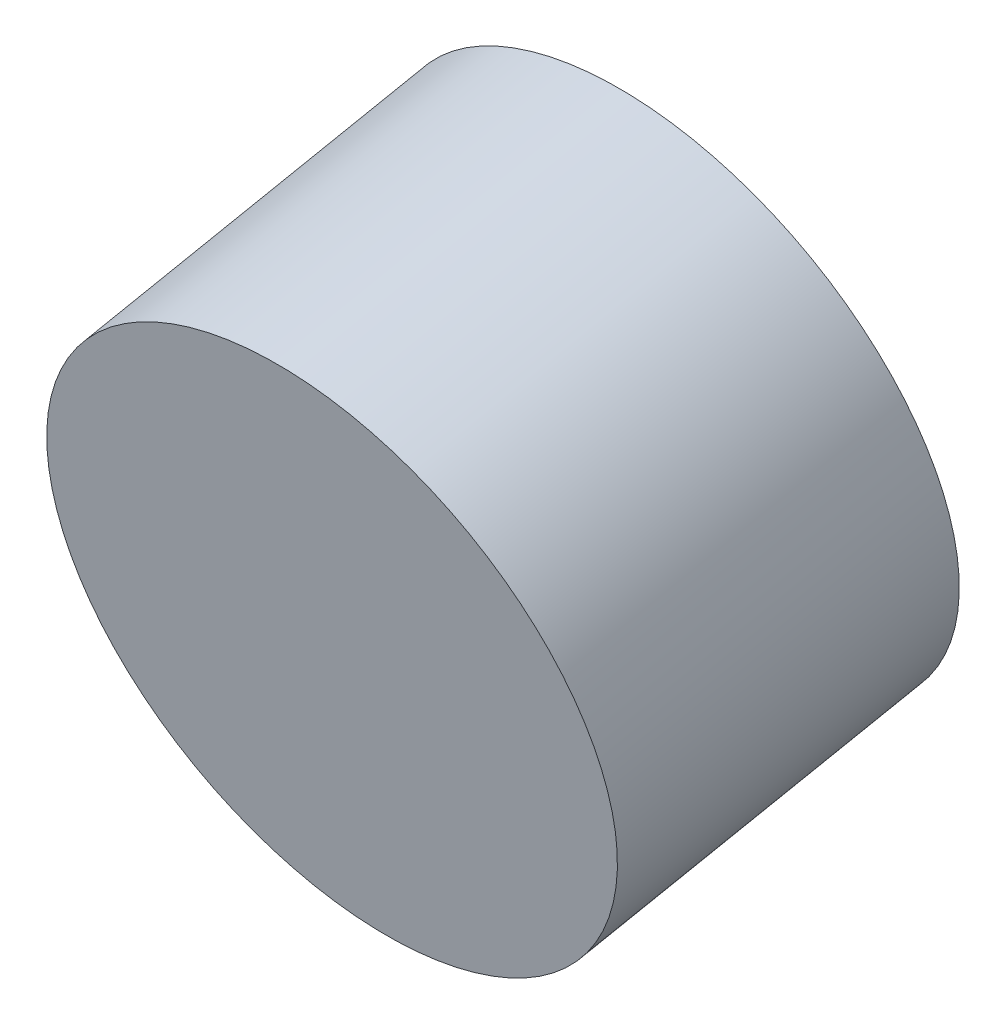
ISO-10303-21;
HEADER;
FILE_DESCRIPTION(('STEP AP214'),'2;1');
FILE_NAME('part.step','',(''),(''),'','','');
FILE_SCHEMA(('AUTOMOTIVE_DESIGN { 1 0 10303 214 1 1 1 1 }'));
ENDSEC;
DATA;
#1=APPLICATION_CONTEXT('core data for automotive mechanical design processes');
#2=APPLICATION_PROTOCOL_DEFINITION('international standard','automotive_design',2000,#1);
#3=PRODUCT_CONTEXT('',#1,'mechanical');
#4=PRODUCT('Part','Part','',(#3));
#5=PRODUCT_RELATED_PRODUCT_CATEGORY('part','',(#4));
#6=PRODUCT_DEFINITION_FORMATION('','',#4);
#7=PRODUCT_DEFINITION_CONTEXT('part definition',#1,'design');
#8=PRODUCT_DEFINITION('design','',#6,#7);
#9=PRODUCT_DEFINITION_SHAPE('','',#8);
#10=(LENGTH_UNIT() NAMED_UNIT(*) SI_UNIT(.MILLI.,.METRE.));
#11=(NAMED_UNIT(*) PLANE_ANGLE_UNIT() SI_UNIT($,.RADIAN.));
#12=(NAMED_UNIT(*) SI_UNIT($,.STERADIAN.) SOLID_ANGLE_UNIT());
#13=UNCERTAINTY_MEASURE_WITH_UNIT(LENGTH_MEASURE(1.E-05),#10,'distance_accuracy_value','');
#14=(GEOMETRIC_REPRESENTATION_CONTEXT(3) GLOBAL_UNCERTAINTY_ASSIGNED_CONTEXT((#13)) GLOBAL_UNIT_ASSIGNED_CONTEXT((#10,
#11,#12)) REPRESENTATION_CONTEXT('',''));
#15=CARTESIAN_POINT('',(0.,0.,0.));
#16=DIRECTION('',(0.,0.,1.));
#17=DIRECTION('',(1.,0.,0.));
#18=AXIS2_PLACEMENT_3D('',#15,#16,#17);
#19=CARTESIAN_POINT('',(2.5,26.7152268386993,5.88496006416696));
#20=DIRECTION('',(0.,0.19509032201613,-0.98078528040323));
#21=DIRECTION('',(0.,0.98078528040323,0.19509032201613));
#22=AXIS2_PLACEMENT_3D('',#19,#20,#21);
#23=CYLINDRICAL_SURFACE('',#22,0.9);
#24=CARTESIAN_POINT('',(2.5,26.7152268386993,5.88496006416696));
#25=DIRECTION('',(0.,-0.19509032201613,0.98078528040323));
#26=DIRECTION('',(1.,0.,0.));
#27=AXIS2_PLACEMENT_3D('',#24,#25,#26);
#28=CIRCLE('',#27,0.9);
#29=CARTESIAN_POINT('',(3.4,26.7152268386993,5.88496006416696));
#30=VERTEX_POINT('',#29);
#31=EDGE_CURVE('E22',#30,#30,#28,.T.);
#32=ORIENTED_EDGE('',*,*,#31,.F.);
#33=EDGE_LOOP('',(#32));
#34=FACE_BOUND('',#33,.T.);
#35=CARTESIAN_POINT('',(2.5,26.9337279993574,4.78648055011534));
#36=DIRECTION('',(0.,-0.19509032201613,0.98078528040323));
#37=DIRECTION('',(1.,0.,0.));
#38=AXIS2_PLACEMENT_3D('',#35,#36,#37);
#39=CIRCLE('',#38,0.9);
#40=CARTESIAN_POINT('',(3.4,26.9337279993574,4.78648055011535));
#41=VERTEX_POINT('',#40);
#42=EDGE_CURVE('E10',#41,#41,#39,.T.);
#43=ORIENTED_EDGE('',*,*,#42,.T.);
#44=EDGE_LOOP('',(#43));
#45=FACE_BOUND('',#44,.T.);
#46=ADVANCED_FACE('F15',(#34,#45),#23,.T.);
#47=CARTESIAN_POINT('',(2.5,26.7152268386993,5.88496006416696));
#48=DIRECTION('',(0.,-0.19509032201613,0.98078528040323));
#49=DIRECTION('',(0.,-0.98078528040323,-0.19509032201613));
#50=AXIS2_PLACEMENT_3D('',#47,#48,#49);
#51=PLANE('',#50);
#52=ORIENTED_EDGE('',*,*,#31,.T.);
#53=EDGE_LOOP('',(#52));
#54=FACE_BOUND('',#53,.T.);
#55=ADVANCED_FACE('F28',(#54),#51,.T.);
#56=CARTESIAN_POINT('',(2.5,26.9337279993574,4.78648055011535));
#57=DIRECTION('',(0.,-0.19509032201613,0.98078528040323));
#58=DIRECTION('',(0.,-0.98078528040323,-0.19509032201613));
#59=AXIS2_PLACEMENT_3D('',#56,#57,#58);
#60=PLANE('',#59);
#61=ORIENTED_EDGE('',*,*,#42,.F.);
#62=EDGE_LOOP('',(#61));
#63=FACE_BOUND('',#62,.T.);
#64=ADVANCED_FACE('F17',(#63),#60,.F.);
#65=CLOSED_SHELL('',(#46,#55,#64));
#66=MANIFOLD_SOLID_BREP('B1',#65);
#67=ADVANCED_BREP_SHAPE_REPRESENTATION('',(#18,#66),#14);
#68=SHAPE_DEFINITION_REPRESENTATION(#9,#67);
ENDSEC;
END-ISO-10303-21;
